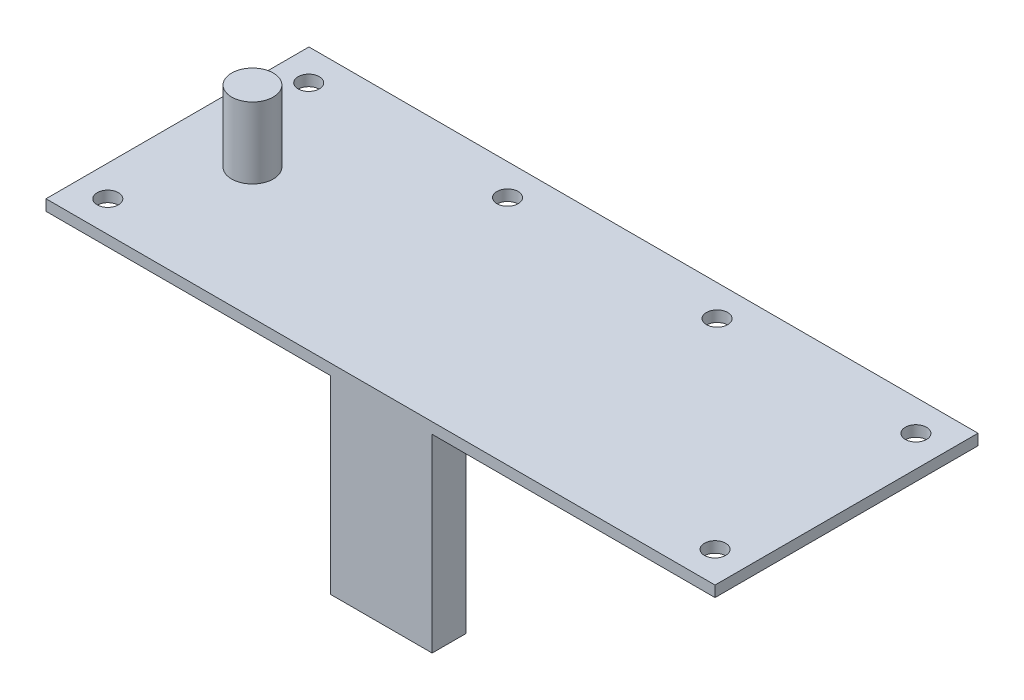
ISO-10303-21;
HEADER;
FILE_DESCRIPTION(('STEP AP214'),'2;1');
FILE_NAME('part.step','',(''),(''),'','','');
FILE_SCHEMA(('AUTOMOTIVE_DESIGN { 1 0 10303 214 1 1 1 1 }'));
ENDSEC;
DATA;
#1=APPLICATION_CONTEXT('core data for automotive mechanical design processes');
#2=APPLICATION_PROTOCOL_DEFINITION('international standard','automotive_design',2000,#1);
#3=PRODUCT_CONTEXT('',#1,'mechanical');
#4=PRODUCT('Part','Part','',(#3));
#5=PRODUCT_RELATED_PRODUCT_CATEGORY('part','',(#4));
#6=PRODUCT_DEFINITION_FORMATION('','',#4);
#7=PRODUCT_DEFINITION_CONTEXT('part definition',#1,'design');
#8=PRODUCT_DEFINITION('design','',#6,#7);
#9=PRODUCT_DEFINITION_SHAPE('','',#8);
#10=(LENGTH_UNIT() NAMED_UNIT(*) SI_UNIT(.MILLI.,.METRE.));
#11=(NAMED_UNIT(*) PLANE_ANGLE_UNIT() SI_UNIT($,.RADIAN.));
#12=(NAMED_UNIT(*) SI_UNIT($,.STERADIAN.) SOLID_ANGLE_UNIT());
#13=UNCERTAINTY_MEASURE_WITH_UNIT(LENGTH_MEASURE(1.E-05),#10,'distance_accuracy_value','');
#14=(GEOMETRIC_REPRESENTATION_CONTEXT(3) GLOBAL_UNCERTAINTY_ASSIGNED_CONTEXT((#13)) GLOBAL_UNIT_ASSIGNED_CONTEXT((#10,
#11,#12)) REPRESENTATION_CONTEXT('',''));
#15=CARTESIAN_POINT('',(0.,0.,0.));
#16=DIRECTION('',(0.,0.,1.));
#17=DIRECTION('',(1.,0.,0.));
#18=AXIS2_PLACEMENT_3D('',#15,#16,#17);
#19=CARTESIAN_POINT('',(0.,1.6383,0.));
#20=DIRECTION('',(0.,-1.,0.));
#21=DIRECTION('',(0.,0.,-1.));
#22=AXIS2_PLACEMENT_3D('',#19,#20,#21);
#23=PLANE('',#22);
#24=CARTESIAN_POINT('',(11.3792,1.6383,-19.6215));
#25=DIRECTION('',(0.,-1.,0.));
#26=DIRECTION('',(0.,0.,-1.));
#27=AXIS2_PLACEMENT_3D('',#24,#25,#26);
#28=CIRCLE('',#27,3.1242);
#29=CARTESIAN_POINT('',(11.3792,1.6383,-22.7457));
#30=VERTEX_POINT('',#29);
#31=EDGE_CURVE('E11',#30,#30,#28,.F.);
#32=ORIENTED_EDGE('',*,*,#31,.F.);
#33=EDGE_LOOP('',(#32));
#34=FACE_BOUND('',#33,.T.);
#35=DIRECTION('',(0.,0.,1.));
#36=VECTOR('',#35,1.);
#37=CARTESIAN_POINT('',(0.,1.6383,0.));
#38=LINE('',#37,#36);
#39=CARTESIAN_POINT('',(0.,1.6383,-39.4843));
#40=VERTEX_POINT('',#39);
#41=CARTESIAN_POINT('',(0.,1.6383,0.));
#42=VERTEX_POINT('',#41);
#43=EDGE_CURVE('E188',#40,#42,#38,.T.);
#44=ORIENTED_EDGE('',*,*,#43,.T.);
#45=DIRECTION('',(1.,0.,0.));
#46=VECTOR('',#45,1.);
#47=CARTESIAN_POINT('',(0.,1.6383,0.));
#48=LINE('',#47,#46);
#49=CARTESIAN_POINT('',(100.457,1.6383,0.));
#50=VERTEX_POINT('',#49);
#51=EDGE_CURVE('E192',#42,#50,#48,.T.);
#52=ORIENTED_EDGE('',*,*,#51,.T.);
#53=DIRECTION('',(0.,0.,-1.));
#54=VECTOR('',#53,1.);
#55=CARTESIAN_POINT('',(100.457,1.6383,0.));
#56=LINE('',#55,#54);
#57=CARTESIAN_POINT('',(100.457,1.6383,-39.4843));
#58=VERTEX_POINT('',#57);
#59=EDGE_CURVE('E196',#50,#58,#56,.T.);
#60=ORIENTED_EDGE('',*,*,#59,.T.);
#61=DIRECTION('',(-1.,0.,0.));
#62=VECTOR('',#61,1.);
#63=CARTESIAN_POINT('',(0.,1.6383,-39.4843));
#64=LINE('',#63,#62);
#65=EDGE_CURVE('E199',#58,#40,#64,.T.);
#66=ORIENTED_EDGE('',*,*,#65,.T.);
#67=EDGE_LOOP('',(#44,#52,#60,#66));
#68=FACE_BOUND('',#67,.T.);
#69=CARTESIAN_POINT('',(4.64185,1.6383,-34.80435));
#70=DIRECTION('',(0.,1.,0.));
#71=DIRECTION('',(0.,0.,1.));
#72=AXIS2_PLACEMENT_3D('',#69,#70,#71);
#73=CIRCLE('',#72,1.59385);
#74=CARTESIAN_POINT('',(4.64185,1.6383,-36.3982));
#75=VERTEX_POINT('',#74);
#76=EDGE_CURVE('E180',#75,#75,#73,.T.);
#77=ORIENTED_EDGE('',*,*,#76,.F.);
#78=EDGE_LOOP('',(#77));
#79=FACE_BOUND('',#78,.T.);
#80=CARTESIAN_POINT('',(65.95745,1.6383,-34.80435));
#81=DIRECTION('',(0.,1.,0.));
#82=DIRECTION('',(0.,0.,-1.));
#83=AXIS2_PLACEMENT_3D('',#80,#81,#82);
#84=CIRCLE('',#83,1.59385);
#85=CARTESIAN_POINT('',(65.95745,1.6383,-36.3982));
#86=VERTEX_POINT('',#85);
#87=EDGE_CURVE('E172',#86,#86,#84,.T.);
#88=ORIENTED_EDGE('',*,*,#87,.F.);
#89=EDGE_LOOP('',(#88));
#90=FACE_BOUND('',#89,.T.);
#91=CARTESIAN_POINT('',(34.49955,1.6383,-34.80435));
#92=DIRECTION('',(0.,1.,0.));
#93=DIRECTION('',(0.,0.,1.));
#94=AXIS2_PLACEMENT_3D('',#91,#92,#93);
#95=CIRCLE('',#94,1.59385);
#96=CARTESIAN_POINT('',(34.49955,1.6383,-36.3982));
#97=VERTEX_POINT('',#96);
#98=EDGE_CURVE('E164',#97,#97,#95,.T.);
#99=ORIENTED_EDGE('',*,*,#98,.F.);
#100=EDGE_LOOP('',(#99));
#101=FACE_BOUND('',#100,.T.);
#102=CARTESIAN_POINT('',(95.81515,1.6383,-34.80435));
#103=DIRECTION('',(0.,1.,0.));
#104=DIRECTION('',(0.,0.,-1.));
#105=AXIS2_PLACEMENT_3D('',#102,#103,#104);
#106=CIRCLE('',#105,1.59385);
#107=CARTESIAN_POINT('',(95.81515,1.6383,-36.3982));
#108=VERTEX_POINT('',#107);
#109=EDGE_CURVE('E156',#108,#108,#106,.T.);
#110=ORIENTED_EDGE('',*,*,#109,.F.);
#111=EDGE_LOOP('',(#110));
#112=FACE_BOUND('',#111,.T.);
#113=CARTESIAN_POINT('',(4.64185,1.6383,-4.64185));
#114=DIRECTION('',(0.,1.,0.));
#115=DIRECTION('',(0.,0.,1.));
#116=AXIS2_PLACEMENT_3D('',#113,#114,#115);
#117=CIRCLE('',#116,1.59385);
#118=CARTESIAN_POINT('',(4.64185,1.6383,-6.2357));
#119=VERTEX_POINT('',#118);
#120=EDGE_CURVE('E148',#119,#119,#117,.T.);
#121=ORIENTED_EDGE('',*,*,#120,.F.);
#122=EDGE_LOOP('',(#121));
#123=FACE_BOUND('',#122,.T.);
#124=CARTESIAN_POINT('',(95.81515,1.6383,-4.64185000000001));
#125=DIRECTION('',(0.,1.,0.));
#126=DIRECTION('',(0.,0.,-1.));
#127=AXIS2_PLACEMENT_3D('',#124,#125,#126);
#128=CIRCLE('',#127,1.59385);
#129=CARTESIAN_POINT('',(95.81515,1.6383,-6.23570000000001));
#130=VERTEX_POINT('',#129);
#131=EDGE_CURVE('E140',#130,#130,#128,.T.);
#132=ORIENTED_EDGE('',*,*,#131,.F.);
#133=EDGE_LOOP('',(#132));
#134=FACE_BOUND('',#133,.T.);
#135=ADVANCED_FACE('F39',(#34,#68,#79,#90,#101,#112,#123,#134),#23,.F.);
#136=CARTESIAN_POINT('',(0.,0.,0.));
#137=DIRECTION('',(0.,-1.,0.));
#138=DIRECTION('',(0.,0.,-1.));
#139=AXIS2_PLACEMENT_3D('',#136,#137,#138);
#140=PLANE('',#139);
#141=DIRECTION('',(0.,0.,1.));
#142=VECTOR('',#141,1.);
#143=CARTESIAN_POINT('',(57.98185,0.,0.));
#144=LINE('',#143,#142);
#145=CARTESIAN_POINT('',(57.98185,0.,-5.08));
#146=VERTEX_POINT('',#145);
#147=CARTESIAN_POINT('',(57.98185,0.,0.));
#148=VERTEX_POINT('',#147);
#149=EDGE_CURVE('E55',#146,#148,#144,.T.);
#150=ORIENTED_EDGE('',*,*,#149,.F.);
#151=DIRECTION('',(1.,0.,0.));
#152=VECTOR('',#151,1.);
#153=CARTESIAN_POINT('',(57.98185,0.,-5.08));
#154=LINE('',#153,#152);
#155=CARTESIAN_POINT('',(42.74185,0.,-5.08));
#156=VERTEX_POINT('',#155);
#157=EDGE_CURVE('E125',#156,#146,#154,.T.);
#158=ORIENTED_EDGE('',*,*,#157,.F.);
#159=DIRECTION('',(0.,0.,-1.));
#160=VECTOR('',#159,1.);
#161=CARTESIAN_POINT('',(42.74185,0.,0.));
#162=LINE('',#161,#160);
#163=CARTESIAN_POINT('',(42.74185,0.,0.));
#164=VERTEX_POINT('',#163);
#165=EDGE_CURVE('E236',#164,#156,#162,.T.);
#166=ORIENTED_EDGE('',*,*,#165,.F.);
#167=DIRECTION('',(1.,0.,0.));
#168=VECTOR('',#167,1.);
#169=CARTESIAN_POINT('',(0.,0.,0.));
#170=LINE('',#169,#168);
#171=CARTESIAN_POINT('',(0.,0.,0.));
#172=VERTEX_POINT('',#171);
#173=EDGE_CURVE('E206',#172,#164,#170,.T.);
#174=ORIENTED_EDGE('',*,*,#173,.F.);
#175=DIRECTION('',(0.,0.,1.));
#176=VECTOR('',#175,1.);
#177=CARTESIAN_POINT('',(0.,0.,0.));
#178=LINE('',#177,#176);
#179=CARTESIAN_POINT('',(0.,0.,-39.4843));
#180=VERTEX_POINT('',#179);
#181=EDGE_CURVE('E184',#180,#172,#178,.T.);
#182=ORIENTED_EDGE('',*,*,#181,.F.);
#183=DIRECTION('',(-1.,0.,0.));
#184=VECTOR('',#183,1.);
#185=CARTESIAN_POINT('',(0.,0.,-39.4843));
#186=LINE('',#185,#184);
#187=CARTESIAN_POINT('',(100.457,0.,-39.4843));
#188=VERTEX_POINT('',#187);
#189=EDGE_CURVE('E193',#188,#180,#186,.T.);
#190=ORIENTED_EDGE('',*,*,#189,.F.);
#191=DIRECTION('',(0.,0.,-1.));
#192=VECTOR('',#191,1.);
#193=CARTESIAN_POINT('',(100.457,0.,0.));
#194=LINE('',#193,#192);
#195=CARTESIAN_POINT('',(100.457,0.,0.));
#196=VERTEX_POINT('',#195);
#197=EDGE_CURVE('E209',#196,#188,#194,.T.);
#198=ORIENTED_EDGE('',*,*,#197,.F.);
#199=EDGE_CURVE('E60',#148,#196,#170,.T.);
#200=ORIENTED_EDGE('',*,*,#199,.F.);
#201=EDGE_LOOP('',(#150,#158,#166,#174,#182,#190,#198,#200));
#202=FACE_BOUND('',#201,.T.);
#203=CARTESIAN_POINT('',(4.64185,0.,-4.64185));
#204=DIRECTION('',(0.,1.,0.));
#205=DIRECTION('',(0.,0.,1.));
#206=AXIS2_PLACEMENT_3D('',#203,#204,#205);
#207=CIRCLE('',#206,1.59385);
#208=CARTESIAN_POINT('',(4.64185,0.,-6.2357));
#209=VERTEX_POINT('',#208);
#210=EDGE_CURVE('E144',#209,#209,#207,.T.);
#211=ORIENTED_EDGE('',*,*,#210,.T.);
#212=EDGE_LOOP('',(#211));
#213=FACE_BOUND('',#212,.T.);
#214=CARTESIAN_POINT('',(34.49955,0.,-34.80435));
#215=DIRECTION('',(0.,1.,0.));
#216=DIRECTION('',(0.,0.,1.));
#217=AXIS2_PLACEMENT_3D('',#214,#215,#216);
#218=CIRCLE('',#217,1.59385);
#219=CARTESIAN_POINT('',(34.49955,0.,-36.3982));
#220=VERTEX_POINT('',#219);
#221=EDGE_CURVE('E160',#220,#220,#218,.T.);
#222=ORIENTED_EDGE('',*,*,#221,.T.);
#223=EDGE_LOOP('',(#222));
#224=FACE_BOUND('',#223,.T.);
#225=CARTESIAN_POINT('',(4.64185,0.,-34.80435));
#226=DIRECTION('',(0.,1.,0.));
#227=DIRECTION('',(0.,0.,1.));
#228=AXIS2_PLACEMENT_3D('',#225,#226,#227);
#229=CIRCLE('',#228,1.59385);
#230=CARTESIAN_POINT('',(4.64185,0.,-36.3982));
#231=VERTEX_POINT('',#230);
#232=EDGE_CURVE('E176',#231,#231,#229,.T.);
#233=ORIENTED_EDGE('',*,*,#232,.T.);
#234=EDGE_LOOP('',(#233));
#235=FACE_BOUND('',#234,.T.);
#236=CARTESIAN_POINT('',(65.95745,0.,-34.80435));
#237=DIRECTION('',(0.,1.,0.));
#238=DIRECTION('',(0.,0.,-1.));
#239=AXIS2_PLACEMENT_3D('',#236,#237,#238);
#240=CIRCLE('',#239,1.59385);
#241=CARTESIAN_POINT('',(65.95745,0.,-36.3982));
#242=VERTEX_POINT('',#241);
#243=EDGE_CURVE('E168',#242,#242,#240,.T.);
#244=ORIENTED_EDGE('',*,*,#243,.T.);
#245=EDGE_LOOP('',(#244));
#246=FACE_BOUND('',#245,.T.);
#247=CARTESIAN_POINT('',(95.81515,0.,-34.80435));
#248=DIRECTION('',(0.,1.,0.));
#249=DIRECTION('',(0.,0.,-1.));
#250=AXIS2_PLACEMENT_3D('',#247,#248,#249);
#251=CIRCLE('',#250,1.59385);
#252=CARTESIAN_POINT('',(95.81515,0.,-36.3982));
#253=VERTEX_POINT('',#252);
#254=EDGE_CURVE('E152',#253,#253,#251,.T.);
#255=ORIENTED_EDGE('',*,*,#254,.T.);
#256=EDGE_LOOP('',(#255));
#257=FACE_BOUND('',#256,.T.);
#258=CARTESIAN_POINT('',(95.81515,0.,-4.64185000000001));
#259=DIRECTION('',(0.,1.,0.));
#260=DIRECTION('',(0.,0.,-1.));
#261=AXIS2_PLACEMENT_3D('',#258,#259,#260);
#262=CIRCLE('',#261,1.59385);
#263=CARTESIAN_POINT('',(95.81515,0.,-6.23570000000001));
#264=VERTEX_POINT('',#263);
#265=EDGE_CURVE('E134',#264,#264,#262,.T.);
#266=ORIENTED_EDGE('',*,*,#265,.T.);
#267=EDGE_LOOP('',(#266));
#268=FACE_BOUND('',#267,.T.);
#269=ADVANCED_FACE('F233',(#202,#213,#224,#235,#246,#257,#268),#140,.T.);
#270=CARTESIAN_POINT('',(0.,1.6383,0.));
#271=DIRECTION('',(1.,0.,0.));
#272=DIRECTION('',(0.,0.,-1.));
#273=AXIS2_PLACEMENT_3D('',#270,#271,#272);
#274=PLANE('',#273);
#275=ORIENTED_EDGE('',*,*,#181,.T.);
#276=DIRECTION('',(0.,-1.,0.));
#277=VECTOR('',#276,1.);
#278=CARTESIAN_POINT('',(0.,1.6383,0.));
#279=LINE('',#278,#277);
#280=EDGE_CURVE('E48',#42,#172,#279,.T.);
#281=ORIENTED_EDGE('',*,*,#280,.F.);
#282=ORIENTED_EDGE('',*,*,#43,.F.);
#283=DIRECTION('',(0.,-1.,0.));
#284=VECTOR('',#283,1.);
#285=CARTESIAN_POINT('',(0.,1.6383,-39.4843));
#286=LINE('',#285,#284);
#287=EDGE_CURVE('E202',#40,#180,#286,.T.);
#288=ORIENTED_EDGE('',*,*,#287,.T.);
#289=EDGE_LOOP('',(#275,#281,#282,#288));
#290=FACE_BOUND('',#289,.T.);
#291=ADVANCED_FACE('F41',(#290),#274,.F.);
#292=CARTESIAN_POINT('',(0.,1.6383,0.));
#293=DIRECTION('',(0.,0.,-1.));
#294=DIRECTION('',(-1.,0.,0.));
#295=AXIS2_PLACEMENT_3D('',#292,#293,#294);
#296=PLANE('',#295);
#297=ORIENTED_EDGE('',*,*,#173,.T.);
#298=DIRECTION('',(0.,1.,0.));
#299=VECTOR('',#298,1.);
#300=CARTESIAN_POINT('',(42.74185,-28.448,0.));
#301=LINE('',#300,#299);
#302=CARTESIAN_POINT('',(42.74185,-28.448,0.));
#303=VERTEX_POINT('',#302);
#304=EDGE_CURVE('E110',#303,#164,#301,.T.);
#305=ORIENTED_EDGE('',*,*,#304,.F.);
#306=DIRECTION('',(-1.,0.,0.));
#307=VECTOR('',#306,1.);
#308=CARTESIAN_POINT('',(57.98185,-28.448,0.));
#309=LINE('',#308,#307);
#310=CARTESIAN_POINT('',(57.98185,-28.448,0.));
#311=VERTEX_POINT('',#310);
#312=EDGE_CURVE('E103',#311,#303,#309,.T.);
#313=ORIENTED_EDGE('',*,*,#312,.F.);
#314=DIRECTION('',(0.,1.,0.));
#315=VECTOR('',#314,1.);
#316=CARTESIAN_POINT('',(57.98185,-28.448,0.));
#317=LINE('',#316,#315);
#318=EDGE_CURVE('E108',#311,#148,#317,.T.);
#319=ORIENTED_EDGE('',*,*,#318,.T.);
#320=ORIENTED_EDGE('',*,*,#199,.T.);
#321=DIRECTION('',(0.,-1.,0.));
#322=VECTOR('',#321,1.);
#323=CARTESIAN_POINT('',(100.457,1.6383,0.));
#324=LINE('',#323,#322);
#325=EDGE_CURVE('E221',#50,#196,#324,.T.);
#326=ORIENTED_EDGE('',*,*,#325,.F.);
#327=ORIENTED_EDGE('',*,*,#51,.F.);
#328=ORIENTED_EDGE('',*,*,#280,.T.);
#329=EDGE_LOOP('',(#297,#305,#313,#319,#320,#326,#327,#328));
#330=FACE_BOUND('',#329,.T.);
#331=ADVANCED_FACE('F106',(#330),#296,.F.);
#332=CARTESIAN_POINT('',(100.457,1.6383,0.));
#333=DIRECTION('',(-1.,0.,0.));
#334=DIRECTION('',(0.,0.,1.));
#335=AXIS2_PLACEMENT_3D('',#332,#333,#334);
#336=PLANE('',#335);
#337=ORIENTED_EDGE('',*,*,#197,.T.);
#338=DIRECTION('',(0.,-1.,0.));
#339=VECTOR('',#338,1.);
#340=CARTESIAN_POINT('',(100.457,1.6383,-39.4843));
#341=LINE('',#340,#339);
#342=EDGE_CURVE('E217',#58,#188,#341,.T.);
#343=ORIENTED_EDGE('',*,*,#342,.F.);
#344=ORIENTED_EDGE('',*,*,#59,.F.);
#345=ORIENTED_EDGE('',*,*,#325,.T.);
#346=EDGE_LOOP('',(#337,#343,#344,#345));
#347=FACE_BOUND('',#346,.T.);
#348=ADVANCED_FACE('F282',(#347),#336,.F.);
#349=CARTESIAN_POINT('',(0.,1.6383,-39.4843));
#350=DIRECTION('',(0.,0.,1.));
#351=DIRECTION('',(1.,0.,0.));
#352=AXIS2_PLACEMENT_3D('',#349,#350,#351);
#353=PLANE('',#352);
#354=ORIENTED_EDGE('',*,*,#189,.T.);
#355=ORIENTED_EDGE('',*,*,#287,.F.);
#356=ORIENTED_EDGE('',*,*,#65,.F.);
#357=ORIENTED_EDGE('',*,*,#342,.T.);
#358=EDGE_LOOP('',(#354,#355,#356,#357));
#359=FACE_BOUND('',#358,.T.);
#360=ADVANCED_FACE('F279',(#359),#353,.F.);
#361=CARTESIAN_POINT('',(4.64185,1.6383,-34.80435));
#362=DIRECTION('',(0.,-1.,0.));
#363=DIRECTION('',(0.,0.,-1.));
#364=AXIS2_PLACEMENT_3D('',#361,#362,#363);
#365=CYLINDRICAL_SURFACE('',#364,1.59385);
#366=CARTESIAN_POINT('',(4.64185,1.6383,-36.3982));
#367=CARTESIAN_POINT('',(4.64185,1.621234375,-36.3982));
#368=CARTESIAN_POINT('',(4.64185,1.60416875,-36.3982));
#369=CARTESIAN_POINT('',(4.64185,1.5700375,-36.3982));
#370=CARTESIAN_POINT('',(4.64185,1.552971875,-36.3982));
#371=CARTESIAN_POINT('',(4.64185,1.518840625,-36.3982));
#372=CARTESIAN_POINT('',(4.64185,1.501775,-36.3982));
#373=CARTESIAN_POINT('',(4.64185,1.46764375,-36.3982));
#374=CARTESIAN_POINT('',(4.64185,1.450578125,-36.3982));
#375=CARTESIAN_POINT('',(4.64185,1.416446875,-36.3982));
#376=CARTESIAN_POINT('',(4.64185,1.39938125,-36.3982));
#377=CARTESIAN_POINT('',(4.64185,1.36525,-36.3982));
#378=CARTESIAN_POINT('',(4.64185,1.348184375,-36.3982));
#379=CARTESIAN_POINT('',(4.64185,1.314053125,-36.3982));
#380=CARTESIAN_POINT('',(4.64185,1.2969875,-36.3982));
#381=CARTESIAN_POINT('',(4.64185,1.26285625,-36.3982));
#382=CARTESIAN_POINT('',(4.64185,1.245790625,-36.3982));
#383=CARTESIAN_POINT('',(4.64185,1.211659375,-36.3982));
#384=CARTESIAN_POINT('',(4.64185,1.19459375,-36.3982));
#385=CARTESIAN_POINT('',(4.64185,1.1604625,-36.3982));
#386=CARTESIAN_POINT('',(4.64185,1.143396875,-36.3982));
#387=CARTESIAN_POINT('',(4.64185,1.109265625,-36.3982));
#388=CARTESIAN_POINT('',(4.64185,1.0922,-36.3982));
#389=CARTESIAN_POINT('',(4.64185,1.05806875,-36.3982));
#390=CARTESIAN_POINT('',(4.64185,1.041003125,-36.3982));
#391=CARTESIAN_POINT('',(4.64185,1.006871875,-36.3982));
#392=CARTESIAN_POINT('',(4.64185,0.98980625,-36.3982));
#393=CARTESIAN_POINT('',(4.64185,0.955675,-36.3982));
#394=CARTESIAN_POINT('',(4.64185,0.938609375,-36.3982));
#395=CARTESIAN_POINT('',(4.64185,0.904478125,-36.3982));
#396=CARTESIAN_POINT('',(4.64185,0.8874125,-36.3982));
#397=CARTESIAN_POINT('',(4.64185,0.85328125,-36.3982));
#398=CARTESIAN_POINT('',(4.64185,0.836215625,-36.3982));
#399=CARTESIAN_POINT('',(4.64185,0.802084375,-36.3982));
#400=CARTESIAN_POINT('',(4.64185,0.78501875,-36.3982));
#401=CARTESIAN_POINT('',(4.64185,0.7508875,-36.3982));
#402=CARTESIAN_POINT('',(4.64185,0.733821875,-36.3982));
#403=CARTESIAN_POINT('',(4.64185,0.699690625,-36.3982));
#404=CARTESIAN_POINT('',(4.64185,0.682625,-36.3982));
#405=CARTESIAN_POINT('',(4.64185,0.64849375,-36.3982));
#406=CARTESIAN_POINT('',(4.64185,0.631428125,-36.3982));
#407=CARTESIAN_POINT('',(4.64185,0.597296875,-36.3982));
#408=CARTESIAN_POINT('',(4.64185,0.58023125,-36.3982));
#409=CARTESIAN_POINT('',(4.64185,0.5461,-36.3982));
#410=CARTESIAN_POINT('',(4.64185,0.529034375,-36.3982));
#411=CARTESIAN_POINT('',(4.64185,0.494903125,-36.3982));
#412=CARTESIAN_POINT('',(4.64185,0.4778375,-36.3982));
#413=CARTESIAN_POINT('',(4.64185,0.44370625,-36.3982));
#414=CARTESIAN_POINT('',(4.64185,0.426640625,-36.3982));
#415=CARTESIAN_POINT('',(4.64185,0.392509375,-36.3982));
#416=CARTESIAN_POINT('',(4.64185,0.37544375,-36.3982));
#417=CARTESIAN_POINT('',(4.64185,0.3413125,-36.3982));
#418=CARTESIAN_POINT('',(4.64185,0.324246875,-36.3982));
#419=CARTESIAN_POINT('',(4.64185,0.290115625,-36.3982));
#420=CARTESIAN_POINT('',(4.64185,0.27305,-36.3982));
#421=CARTESIAN_POINT('',(4.64185,0.23891875,-36.3982));
#422=CARTESIAN_POINT('',(4.64185,0.221853125,-36.3982));
#423=CARTESIAN_POINT('',(4.64185,0.187721875,-36.3982));
#424=CARTESIAN_POINT('',(4.64185,0.17065625,-36.3982));
#425=CARTESIAN_POINT('',(4.64185,0.136525,-36.3982));
#426=CARTESIAN_POINT('',(4.64185,0.119459375,-36.3982));
#427=CARTESIAN_POINT('',(4.64185,0.0853281249999998,-36.3982));
#428=CARTESIAN_POINT('',(4.64185,0.0682624999999998,-36.3982));
#429=CARTESIAN_POINT('',(4.64185,0.0341312499999998,-36.3982));
#430=CARTESIAN_POINT('',(4.64185,0.0170656249999998,-36.3982));
#431=CARTESIAN_POINT('',(4.64185,0.,-36.3982));
#432=B_SPLINE_CURVE_WITH_KNOTS('',3,(#366,#367,#368,#369,#370,#371,#372,#373,#374,#375,#376,
#377,#378,#379,#380,#381,#382,#383,#384,#385,#386,#387,#388,#389,#390,#391,#392,#393,#394,#395,
#396,#397,#398,#399,#400,#401,#402,#403,#404,#405,#406,#407,#408,#409,#410,#411,#412,#413,#414,
#415,#416,#417,#418,#419,#420,#421,#422,#423,#424,#425,#426,#427,#428,#429,#430,#431),
.UNSPECIFIED.,.F.,.F.,(4,2,2,2,2,2,2,2,2,2,2,2,2,2,2,2,2,2,2,2,2,2,2,2,2,2,2,2,2,2,2,2,4),(0.,
0.0511968749999999,0.10239375,0.153590625,0.2047875,0.255984375,0.30718125,0.358378125,0.409575,
0.460771875,0.51196875,0.563165625,0.6143625,0.665559375,0.71675625,0.767953125,0.81915,
0.870346875,0.92154375,0.972740625,1.0239375,1.075134375,1.12633125,1.177528125,1.228725,
1.279921875,1.33111875,1.382315625,1.4335125,1.484709375,1.53590625,1.587103125,1.6383),.UNSPECIFIED.);
#433=EDGE_CURVE('BSEAM276',#75,#231,#432,.T.);
#434=ORIENTED_EDGE('',*,*,#76,.T.);
#435=ORIENTED_EDGE('',*,*,#232,.F.);
#436=ORIENTED_EDGE('',*,*,#433,.T.);
#437=ORIENTED_EDGE('',*,*,#433,.F.);
#438=EDGE_LOOP('',(#434,#436,#435,#437));
#439=FACE_BOUND('',#438,.T.);
#440=ADVANCED_FACE('F276',(#439),#365,.F.);
#441=CARTESIAN_POINT('',(65.95745,1.6383,-34.80435));
#442=DIRECTION('',(0.,-1.,0.));
#443=DIRECTION('',(0.,0.,-1.));
#444=AXIS2_PLACEMENT_3D('',#441,#442,#443);
#445=CYLINDRICAL_SURFACE('',#444,1.59385);
#446=CARTESIAN_POINT('',(65.95745,1.6383,-36.3982));
#447=CARTESIAN_POINT('',(65.95745,1.621234375,-36.3982));
#448=CARTESIAN_POINT('',(65.95745,1.60416875,-36.3982));
#449=CARTESIAN_POINT('',(65.95745,1.5700375,-36.3982));
#450=CARTESIAN_POINT('',(65.95745,1.552971875,-36.3982));
#451=CARTESIAN_POINT('',(65.95745,1.518840625,-36.3982));
#452=CARTESIAN_POINT('',(65.95745,1.501775,-36.3982));
#453=CARTESIAN_POINT('',(65.95745,1.46764375,-36.3982));
#454=CARTESIAN_POINT('',(65.95745,1.450578125,-36.3982));
#455=CARTESIAN_POINT('',(65.95745,1.416446875,-36.3982));
#456=CARTESIAN_POINT('',(65.95745,1.39938125,-36.3982));
#457=CARTESIAN_POINT('',(65.95745,1.36525,-36.3982));
#458=CARTESIAN_POINT('',(65.95745,1.348184375,-36.3982));
#459=CARTESIAN_POINT('',(65.95745,1.314053125,-36.3982));
#460=CARTESIAN_POINT('',(65.95745,1.2969875,-36.3982));
#461=CARTESIAN_POINT('',(65.95745,1.26285625,-36.3982));
#462=CARTESIAN_POINT('',(65.95745,1.245790625,-36.3982));
#463=CARTESIAN_POINT('',(65.95745,1.211659375,-36.3982));
#464=CARTESIAN_POINT('',(65.95745,1.19459375,-36.3982));
#465=CARTESIAN_POINT('',(65.95745,1.1604625,-36.3982));
#466=CARTESIAN_POINT('',(65.95745,1.143396875,-36.3982));
#467=CARTESIAN_POINT('',(65.95745,1.109265625,-36.3982));
#468=CARTESIAN_POINT('',(65.95745,1.0922,-36.3982));
#469=CARTESIAN_POINT('',(65.95745,1.05806875,-36.3982));
#470=CARTESIAN_POINT('',(65.95745,1.041003125,-36.3982));
#471=CARTESIAN_POINT('',(65.95745,1.006871875,-36.3982));
#472=CARTESIAN_POINT('',(65.95745,0.98980625,-36.3982));
#473=CARTESIAN_POINT('',(65.95745,0.955675,-36.3982));
#474=CARTESIAN_POINT('',(65.95745,0.938609375,-36.3982));
#475=CARTESIAN_POINT('',(65.95745,0.904478125,-36.3982));
#476=CARTESIAN_POINT('',(65.95745,0.8874125,-36.3982));
#477=CARTESIAN_POINT('',(65.95745,0.85328125,-36.3982));
#478=CARTESIAN_POINT('',(65.95745,0.836215625,-36.3982));
#479=CARTESIAN_POINT('',(65.95745,0.802084375,-36.3982));
#480=CARTESIAN_POINT('',(65.95745,0.78501875,-36.3982));
#481=CARTESIAN_POINT('',(65.95745,0.7508875,-36.3982));
#482=CARTESIAN_POINT('',(65.95745,0.733821875,-36.3982));
#483=CARTESIAN_POINT('',(65.95745,0.699690625,-36.3982));
#484=CARTESIAN_POINT('',(65.95745,0.682625,-36.3982));
#485=CARTESIAN_POINT('',(65.95745,0.64849375,-36.3982));
#486=CARTESIAN_POINT('',(65.95745,0.631428125,-36.3982));
#487=CARTESIAN_POINT('',(65.95745,0.597296875,-36.3982));
#488=CARTESIAN_POINT('',(65.95745,0.58023125,-36.3982));
#489=CARTESIAN_POINT('',(65.95745,0.5461,-36.3982));
#490=CARTESIAN_POINT('',(65.95745,0.529034375,-36.3982));
#491=CARTESIAN_POINT('',(65.95745,0.494903125,-36.3982));
#492=CARTESIAN_POINT('',(65.95745,0.4778375,-36.3982));
#493=CARTESIAN_POINT('',(65.95745,0.44370625,-36.3982));
#494=CARTESIAN_POINT('',(65.95745,0.426640625,-36.3982));
#495=CARTESIAN_POINT('',(65.95745,0.392509375,-36.3982));
#496=CARTESIAN_POINT('',(65.95745,0.37544375,-36.3982));
#497=CARTESIAN_POINT('',(65.95745,0.3413125,-36.3982));
#498=CARTESIAN_POINT('',(65.95745,0.324246875,-36.3982));
#499=CARTESIAN_POINT('',(65.95745,0.290115625,-36.3982));
#500=CARTESIAN_POINT('',(65.95745,0.27305,-36.3982));
#501=CARTESIAN_POINT('',(65.95745,0.23891875,-36.3982));
#502=CARTESIAN_POINT('',(65.95745,0.221853125,-36.3982));
#503=CARTESIAN_POINT('',(65.95745,0.187721875,-36.3982));
#504=CARTESIAN_POINT('',(65.95745,0.17065625,-36.3982));
#505=CARTESIAN_POINT('',(65.95745,0.136525,-36.3982));
#506=CARTESIAN_POINT('',(65.95745,0.119459375,-36.3982));
#507=CARTESIAN_POINT('',(65.95745,0.0853281249999998,-36.3982));
#508=CARTESIAN_POINT('',(65.95745,0.0682624999999998,-36.3982));
#509=CARTESIAN_POINT('',(65.95745,0.0341312499999998,-36.3982));
#510=CARTESIAN_POINT('',(65.95745,0.0170656249999998,-36.3982));
#511=CARTESIAN_POINT('',(65.95745,0.,-36.3982));
#512=B_SPLINE_CURVE_WITH_KNOTS('',3,(#446,#447,#448,#449,#450,#451,#452,#453,#454,#455,#456,
#457,#458,#459,#460,#461,#462,#463,#464,#465,#466,#467,#468,#469,#470,#471,#472,#473,#474,#475,
#476,#477,#478,#479,#480,#481,#482,#483,#484,#485,#486,#487,#488,#489,#490,#491,#492,#493,#494,
#495,#496,#497,#498,#499,#500,#501,#502,#503,#504,#505,#506,#507,#508,#509,#510,#511),
.UNSPECIFIED.,.F.,.F.,(4,2,2,2,2,2,2,2,2,2,2,2,2,2,2,2,2,2,2,2,2,2,2,2,2,2,2,2,2,2,2,2,4),(0.,
0.0511968749999999,0.10239375,0.153590625,0.2047875,0.255984375,0.30718125,0.358378125,0.409575,
0.460771875,0.51196875,0.563165625,0.6143625,0.665559375,0.71675625,0.767953125,0.81915,
0.870346875,0.92154375,0.972740625,1.0239375,1.075134375,1.12633125,1.177528125,1.228725,
1.279921875,1.33111875,1.382315625,1.4335125,1.484709375,1.53590625,1.587103125,1.6383),.UNSPECIFIED.);
#513=EDGE_CURVE('BSEAM375',#86,#242,#512,.T.);
#514=ORIENTED_EDGE('',*,*,#87,.T.);
#515=ORIENTED_EDGE('',*,*,#243,.F.);
#516=ORIENTED_EDGE('',*,*,#513,.T.);
#517=ORIENTED_EDGE('',*,*,#513,.F.);
#518=EDGE_LOOP('',(#514,#516,#515,#517));
#519=FACE_BOUND('',#518,.T.);
#520=ADVANCED_FACE('F375',(#519),#445,.F.);
#521=CARTESIAN_POINT('',(34.49955,1.6383,-34.80435));
#522=DIRECTION('',(0.,-1.,0.));
#523=DIRECTION('',(0.,0.,-1.));
#524=AXIS2_PLACEMENT_3D('',#521,#522,#523);
#525=CYLINDRICAL_SURFACE('',#524,1.59385);
#526=CARTESIAN_POINT('',(34.49955,1.6383,-36.3982));
#527=CARTESIAN_POINT('',(34.49955,1.621234375,-36.3982));
#528=CARTESIAN_POINT('',(34.49955,1.60416875,-36.3982));
#529=CARTESIAN_POINT('',(34.49955,1.5700375,-36.3982));
#530=CARTESIAN_POINT('',(34.49955,1.552971875,-36.3982));
#531=CARTESIAN_POINT('',(34.49955,1.518840625,-36.3982));
#532=CARTESIAN_POINT('',(34.49955,1.501775,-36.3982));
#533=CARTESIAN_POINT('',(34.49955,1.46764375,-36.3982));
#534=CARTESIAN_POINT('',(34.49955,1.450578125,-36.3982));
#535=CARTESIAN_POINT('',(34.49955,1.416446875,-36.3982));
#536=CARTESIAN_POINT('',(34.49955,1.39938125,-36.3982));
#537=CARTESIAN_POINT('',(34.49955,1.36525,-36.3982));
#538=CARTESIAN_POINT('',(34.49955,1.348184375,-36.3982));
#539=CARTESIAN_POINT('',(34.49955,1.314053125,-36.3982));
#540=CARTESIAN_POINT('',(34.49955,1.2969875,-36.3982));
#541=CARTESIAN_POINT('',(34.49955,1.26285625,-36.3982));
#542=CARTESIAN_POINT('',(34.49955,1.245790625,-36.3982));
#543=CARTESIAN_POINT('',(34.49955,1.211659375,-36.3982));
#544=CARTESIAN_POINT('',(34.49955,1.19459375,-36.3982));
#545=CARTESIAN_POINT('',(34.49955,1.1604625,-36.3982));
#546=CARTESIAN_POINT('',(34.49955,1.143396875,-36.3982));
#547=CARTESIAN_POINT('',(34.49955,1.109265625,-36.3982));
#548=CARTESIAN_POINT('',(34.49955,1.0922,-36.3982));
#549=CARTESIAN_POINT('',(34.49955,1.05806875,-36.3982));
#550=CARTESIAN_POINT('',(34.49955,1.041003125,-36.3982));
#551=CARTESIAN_POINT('',(34.49955,1.006871875,-36.3982));
#552=CARTESIAN_POINT('',(34.49955,0.98980625,-36.3982));
#553=CARTESIAN_POINT('',(34.49955,0.955675,-36.3982));
#554=CARTESIAN_POINT('',(34.49955,0.938609375,-36.3982));
#555=CARTESIAN_POINT('',(34.49955,0.904478125,-36.3982));
#556=CARTESIAN_POINT('',(34.49955,0.8874125,-36.3982));
#557=CARTESIAN_POINT('',(34.49955,0.85328125,-36.3982));
#558=CARTESIAN_POINT('',(34.49955,0.836215625,-36.3982));
#559=CARTESIAN_POINT('',(34.49955,0.802084375,-36.3982));
#560=CARTESIAN_POINT('',(34.49955,0.78501875,-36.3982));
#561=CARTESIAN_POINT('',(34.49955,0.7508875,-36.3982));
#562=CARTESIAN_POINT('',(34.49955,0.733821875,-36.3982));
#563=CARTESIAN_POINT('',(34.49955,0.699690625,-36.3982));
#564=CARTESIAN_POINT('',(34.49955,0.682625,-36.3982));
#565=CARTESIAN_POINT('',(34.49955,0.64849375,-36.3982));
#566=CARTESIAN_POINT('',(34.49955,0.631428125,-36.3982));
#567=CARTESIAN_POINT('',(34.49955,0.597296875,-36.3982));
#568=CARTESIAN_POINT('',(34.49955,0.58023125,-36.3982));
#569=CARTESIAN_POINT('',(34.49955,0.5461,-36.3982));
#570=CARTESIAN_POINT('',(34.49955,0.529034375,-36.3982));
#571=CARTESIAN_POINT('',(34.49955,0.494903125,-36.3982));
#572=CARTESIAN_POINT('',(34.49955,0.4778375,-36.3982));
#573=CARTESIAN_POINT('',(34.49955,0.44370625,-36.3982));
#574=CARTESIAN_POINT('',(34.49955,0.426640625,-36.3982));
#575=CARTESIAN_POINT('',(34.49955,0.392509375,-36.3982));
#576=CARTESIAN_POINT('',(34.49955,0.37544375,-36.3982));
#577=CARTESIAN_POINT('',(34.49955,0.3413125,-36.3982));
#578=CARTESIAN_POINT('',(34.49955,0.324246875,-36.3982));
#579=CARTESIAN_POINT('',(34.49955,0.290115625,-36.3982));
#580=CARTESIAN_POINT('',(34.49955,0.27305,-36.3982));
#581=CARTESIAN_POINT('',(34.49955,0.23891875,-36.3982));
#582=CARTESIAN_POINT('',(34.49955,0.221853125,-36.3982));
#583=CARTESIAN_POINT('',(34.49955,0.187721875,-36.3982));
#584=CARTESIAN_POINT('',(34.49955,0.17065625,-36.3982));
#585=CARTESIAN_POINT('',(34.49955,0.136525,-36.3982));
#586=CARTESIAN_POINT('',(34.49955,0.119459375,-36.3982));
#587=CARTESIAN_POINT('',(34.49955,0.0853281249999998,-36.3982));
#588=CARTESIAN_POINT('',(34.49955,0.0682624999999998,-36.3982));
#589=CARTESIAN_POINT('',(34.49955,0.0341312499999998,-36.3982));
#590=CARTESIAN_POINT('',(34.49955,0.0170656249999998,-36.3982));
#591=CARTESIAN_POINT('',(34.49955,0.,-36.3982));
#592=B_SPLINE_CURVE_WITH_KNOTS('',3,(#526,#527,#528,#529,#530,#531,#532,#533,#534,#535,#536,
#537,#538,#539,#540,#541,#542,#543,#544,#545,#546,#547,#548,#549,#550,#551,#552,#553,#554,#555,
#556,#557,#558,#559,#560,#561,#562,#563,#564,#565,#566,#567,#568,#569,#570,#571,#572,#573,#574,
#575,#576,#577,#578,#579,#580,#581,#582,#583,#584,#585,#586,#587,#588,#589,#590,#591),
.UNSPECIFIED.,.F.,.F.,(4,2,2,2,2,2,2,2,2,2,2,2,2,2,2,2,2,2,2,2,2,2,2,2,2,2,2,2,2,2,2,2,4),(0.,
0.0511968749999999,0.10239375,0.153590625,0.2047875,0.255984375,0.30718125,0.358378125,0.409575,
0.460771875,0.51196875,0.563165625,0.6143625,0.665559375,0.71675625,0.767953125,0.81915,
0.870346875,0.92154375,0.972740625,1.0239375,1.075134375,1.12633125,1.177528125,1.228725,
1.279921875,1.33111875,1.382315625,1.4335125,1.484709375,1.53590625,1.587103125,1.6383),.UNSPECIFIED.);
#593=EDGE_CURVE('BSEAM367',#97,#220,#592,.T.);
#594=ORIENTED_EDGE('',*,*,#98,.T.);
#595=ORIENTED_EDGE('',*,*,#221,.F.);
#596=ORIENTED_EDGE('',*,*,#593,.T.);
#597=ORIENTED_EDGE('',*,*,#593,.F.);
#598=EDGE_LOOP('',(#594,#596,#595,#597));
#599=FACE_BOUND('',#598,.T.);
#600=ADVANCED_FACE('F367',(#599),#525,.F.);
#601=CARTESIAN_POINT('',(95.81515,1.6383,-34.80435));
#602=DIRECTION('',(0.,-1.,0.));
#603=DIRECTION('',(0.,0.,-1.));
#604=AXIS2_PLACEMENT_3D('',#601,#602,#603);
#605=CYLINDRICAL_SURFACE('',#604,1.59385);
#606=CARTESIAN_POINT('',(95.81515,1.6383,-36.3982));
#607=CARTESIAN_POINT('',(95.81515,1.621234375,-36.3982));
#608=CARTESIAN_POINT('',(95.81515,1.60416875,-36.3982));
#609=CARTESIAN_POINT('',(95.81515,1.5700375,-36.3982));
#610=CARTESIAN_POINT('',(95.81515,1.552971875,-36.3982));
#611=CARTESIAN_POINT('',(95.81515,1.518840625,-36.3982));
#612=CARTESIAN_POINT('',(95.81515,1.501775,-36.3982));
#613=CARTESIAN_POINT('',(95.81515,1.46764375,-36.3982));
#614=CARTESIAN_POINT('',(95.81515,1.450578125,-36.3982));
#615=CARTESIAN_POINT('',(95.81515,1.416446875,-36.3982));
#616=CARTESIAN_POINT('',(95.81515,1.39938125,-36.3982));
#617=CARTESIAN_POINT('',(95.81515,1.36525,-36.3982));
#618=CARTESIAN_POINT('',(95.81515,1.348184375,-36.3982));
#619=CARTESIAN_POINT('',(95.81515,1.314053125,-36.3982));
#620=CARTESIAN_POINT('',(95.81515,1.2969875,-36.3982));
#621=CARTESIAN_POINT('',(95.81515,1.26285625,-36.3982));
#622=CARTESIAN_POINT('',(95.81515,1.245790625,-36.3982));
#623=CARTESIAN_POINT('',(95.81515,1.211659375,-36.3982));
#624=CARTESIAN_POINT('',(95.81515,1.19459375,-36.3982));
#625=CARTESIAN_POINT('',(95.81515,1.1604625,-36.3982));
#626=CARTESIAN_POINT('',(95.81515,1.143396875,-36.3982));
#627=CARTESIAN_POINT('',(95.81515,1.109265625,-36.3982));
#628=CARTESIAN_POINT('',(95.81515,1.0922,-36.3982));
#629=CARTESIAN_POINT('',(95.81515,1.05806875,-36.3982));
#630=CARTESIAN_POINT('',(95.81515,1.041003125,-36.3982));
#631=CARTESIAN_POINT('',(95.81515,1.006871875,-36.3982));
#632=CARTESIAN_POINT('',(95.81515,0.98980625,-36.3982));
#633=CARTESIAN_POINT('',(95.81515,0.955675,-36.3982));
#634=CARTESIAN_POINT('',(95.81515,0.938609375,-36.3982));
#635=CARTESIAN_POINT('',(95.81515,0.904478125,-36.3982));
#636=CARTESIAN_POINT('',(95.81515,0.8874125,-36.3982));
#637=CARTESIAN_POINT('',(95.81515,0.85328125,-36.3982));
#638=CARTESIAN_POINT('',(95.81515,0.836215625,-36.3982));
#639=CARTESIAN_POINT('',(95.81515,0.802084375,-36.3982));
#640=CARTESIAN_POINT('',(95.81515,0.78501875,-36.3982));
#641=CARTESIAN_POINT('',(95.81515,0.7508875,-36.3982));
#642=CARTESIAN_POINT('',(95.81515,0.733821875,-36.3982));
#643=CARTESIAN_POINT('',(95.81515,0.699690625,-36.3982));
#644=CARTESIAN_POINT('',(95.81515,0.682625,-36.3982));
#645=CARTESIAN_POINT('',(95.81515,0.64849375,-36.3982));
#646=CARTESIAN_POINT('',(95.81515,0.631428125,-36.3982));
#647=CARTESIAN_POINT('',(95.81515,0.597296875,-36.3982));
#648=CARTESIAN_POINT('',(95.81515,0.58023125,-36.3982));
#649=CARTESIAN_POINT('',(95.81515,0.5461,-36.3982));
#650=CARTESIAN_POINT('',(95.81515,0.529034375,-36.3982));
#651=CARTESIAN_POINT('',(95.81515,0.494903125,-36.3982));
#652=CARTESIAN_POINT('',(95.81515,0.4778375,-36.3982));
#653=CARTESIAN_POINT('',(95.81515,0.44370625,-36.3982));
#654=CARTESIAN_POINT('',(95.81515,0.426640625,-36.3982));
#655=CARTESIAN_POINT('',(95.81515,0.392509375,-36.3982));
#656=CARTESIAN_POINT('',(95.81515,0.37544375,-36.3982));
#657=CARTESIAN_POINT('',(95.81515,0.3413125,-36.3982));
#658=CARTESIAN_POINT('',(95.81515,0.324246875,-36.3982));
#659=CARTESIAN_POINT('',(95.81515,0.290115625,-36.3982));
#660=CARTESIAN_POINT('',(95.81515,0.27305,-36.3982));
#661=CARTESIAN_POINT('',(95.81515,0.23891875,-36.3982));
#662=CARTESIAN_POINT('',(95.81515,0.221853125,-36.3982));
#663=CARTESIAN_POINT('',(95.81515,0.187721875,-36.3982));
#664=CARTESIAN_POINT('',(95.81515,0.17065625,-36.3982));
#665=CARTESIAN_POINT('',(95.81515,0.136525,-36.3982));
#666=CARTESIAN_POINT('',(95.81515,0.119459375,-36.3982));
#667=CARTESIAN_POINT('',(95.81515,0.0853281249999998,-36.3982));
#668=CARTESIAN_POINT('',(95.81515,0.0682624999999998,-36.3982));
#669=CARTESIAN_POINT('',(95.81515,0.0341312499999998,-36.3982));
#670=CARTESIAN_POINT('',(95.81515,0.0170656249999998,-36.3982));
#671=CARTESIAN_POINT('',(95.81515,0.,-36.3982));
#672=B_SPLINE_CURVE_WITH_KNOTS('',3,(#606,#607,#608,#609,#610,#611,#612,#613,#614,#615,#616,
#617,#618,#619,#620,#621,#622,#623,#624,#625,#626,#627,#628,#629,#630,#631,#632,#633,#634,#635,
#636,#637,#638,#639,#640,#641,#642,#643,#644,#645,#646,#647,#648,#649,#650,#651,#652,#653,#654,
#655,#656,#657,#658,#659,#660,#661,#662,#663,#664,#665,#666,#667,#668,#669,#670,#671),
.UNSPECIFIED.,.F.,.F.,(4,2,2,2,2,2,2,2,2,2,2,2,2,2,2,2,2,2,2,2,2,2,2,2,2,2,2,2,2,2,2,2,4),(0.,
0.0511968749999999,0.10239375,0.153590625,0.2047875,0.255984375,0.30718125,0.358378125,0.409575,
0.460771875,0.51196875,0.563165625,0.6143625,0.665559375,0.71675625,0.767953125,0.81915,
0.870346875,0.92154375,0.972740625,1.0239375,1.075134375,1.12633125,1.177528125,1.228725,
1.279921875,1.33111875,1.382315625,1.4335125,1.484709375,1.53590625,1.587103125,1.6383),.UNSPECIFIED.);
#673=EDGE_CURVE('BSEAM359',#108,#253,#672,.T.);
#674=ORIENTED_EDGE('',*,*,#109,.T.);
#675=ORIENTED_EDGE('',*,*,#254,.F.);
#676=ORIENTED_EDGE('',*,*,#673,.T.);
#677=ORIENTED_EDGE('',*,*,#673,.F.);
#678=EDGE_LOOP('',(#674,#676,#675,#677));
#679=FACE_BOUND('',#678,.T.);
#680=ADVANCED_FACE('F359',(#679),#605,.F.);
#681=CARTESIAN_POINT('',(4.64185,1.6383,-4.64185));
#682=DIRECTION('',(0.,-1.,0.));
#683=DIRECTION('',(0.,0.,-1.));
#684=AXIS2_PLACEMENT_3D('',#681,#682,#683);
#685=CYLINDRICAL_SURFACE('',#684,1.59385);
#686=CARTESIAN_POINT('',(4.64185,1.6383,-6.2357));
#687=CARTESIAN_POINT('',(4.64185,1.621234375,-6.2357));
#688=CARTESIAN_POINT('',(4.64185,1.60416875,-6.2357));
#689=CARTESIAN_POINT('',(4.64185,1.5700375,-6.2357));
#690=CARTESIAN_POINT('',(4.64185,1.552971875,-6.2357));
#691=CARTESIAN_POINT('',(4.64185,1.518840625,-6.2357));
#692=CARTESIAN_POINT('',(4.64185,1.501775,-6.2357));
#693=CARTESIAN_POINT('',(4.64185,1.46764375,-6.2357));
#694=CARTESIAN_POINT('',(4.64185,1.450578125,-6.2357));
#695=CARTESIAN_POINT('',(4.64185,1.416446875,-6.2357));
#696=CARTESIAN_POINT('',(4.64185,1.39938125,-6.2357));
#697=CARTESIAN_POINT('',(4.64185,1.36525,-6.2357));
#698=CARTESIAN_POINT('',(4.64185,1.348184375,-6.2357));
#699=CARTESIAN_POINT('',(4.64185,1.314053125,-6.2357));
#700=CARTESIAN_POINT('',(4.64185,1.2969875,-6.2357));
#701=CARTESIAN_POINT('',(4.64185,1.26285625,-6.2357));
#702=CARTESIAN_POINT('',(4.64185,1.245790625,-6.2357));
#703=CARTESIAN_POINT('',(4.64185,1.211659375,-6.2357));
#704=CARTESIAN_POINT('',(4.64185,1.19459375,-6.2357));
#705=CARTESIAN_POINT('',(4.64185,1.1604625,-6.2357));
#706=CARTESIAN_POINT('',(4.64185,1.143396875,-6.2357));
#707=CARTESIAN_POINT('',(4.64185,1.109265625,-6.2357));
#708=CARTESIAN_POINT('',(4.64185,1.0922,-6.2357));
#709=CARTESIAN_POINT('',(4.64185,1.05806875,-6.2357));
#710=CARTESIAN_POINT('',(4.64185,1.041003125,-6.2357));
#711=CARTESIAN_POINT('',(4.64185,1.006871875,-6.2357));
#712=CARTESIAN_POINT('',(4.64185,0.98980625,-6.2357));
#713=CARTESIAN_POINT('',(4.64185,0.955675,-6.2357));
#714=CARTESIAN_POINT('',(4.64185,0.938609375,-6.2357));
#715=CARTESIAN_POINT('',(4.64185,0.904478125,-6.2357));
#716=CARTESIAN_POINT('',(4.64185,0.8874125,-6.2357));
#717=CARTESIAN_POINT('',(4.64185,0.85328125,-6.2357));
#718=CARTESIAN_POINT('',(4.64185,0.836215625,-6.2357));
#719=CARTESIAN_POINT('',(4.64185,0.802084375,-6.2357));
#720=CARTESIAN_POINT('',(4.64185,0.78501875,-6.2357));
#721=CARTESIAN_POINT('',(4.64185,0.7508875,-6.2357));
#722=CARTESIAN_POINT('',(4.64185,0.733821875,-6.2357));
#723=CARTESIAN_POINT('',(4.64185,0.699690625,-6.2357));
#724=CARTESIAN_POINT('',(4.64185,0.682625,-6.2357));
#725=CARTESIAN_POINT('',(4.64185,0.64849375,-6.2357));
#726=CARTESIAN_POINT('',(4.64185,0.631428125,-6.2357));
#727=CARTESIAN_POINT('',(4.64185,0.597296875,-6.2357));
#728=CARTESIAN_POINT('',(4.64185,0.58023125,-6.2357));
#729=CARTESIAN_POINT('',(4.64185,0.5461,-6.2357));
#730=CARTESIAN_POINT('',(4.64185,0.529034375,-6.2357));
#731=CARTESIAN_POINT('',(4.64185,0.494903125,-6.2357));
#732=CARTESIAN_POINT('',(4.64185,0.4778375,-6.2357));
#733=CARTESIAN_POINT('',(4.64185,0.44370625,-6.2357));
#734=CARTESIAN_POINT('',(4.64185,0.426640625,-6.2357));
#735=CARTESIAN_POINT('',(4.64185,0.392509375,-6.2357));
#736=CARTESIAN_POINT('',(4.64185,0.37544375,-6.2357));
#737=CARTESIAN_POINT('',(4.64185,0.3413125,-6.2357));
#738=CARTESIAN_POINT('',(4.64185,0.324246875,-6.2357));
#739=CARTESIAN_POINT('',(4.64185,0.290115625,-6.2357));
#740=CARTESIAN_POINT('',(4.64185,0.27305,-6.2357));
#741=CARTESIAN_POINT('',(4.64185,0.23891875,-6.2357));
#742=CARTESIAN_POINT('',(4.64185,0.221853125,-6.2357));
#743=CARTESIAN_POINT('',(4.64185,0.187721875,-6.2357));
#744=CARTESIAN_POINT('',(4.64185,0.17065625,-6.2357));
#745=CARTESIAN_POINT('',(4.64185,0.136525,-6.2357));
#746=CARTESIAN_POINT('',(4.64185,0.119459375,-6.2357));
#747=CARTESIAN_POINT('',(4.64185,0.0853281249999998,-6.2357));
#748=CARTESIAN_POINT('',(4.64185,0.0682624999999998,-6.2357));
#749=CARTESIAN_POINT('',(4.64185,0.0341312499999998,-6.2357));
#750=CARTESIAN_POINT('',(4.64185,0.0170656249999998,-6.2357));
#751=CARTESIAN_POINT('',(4.64185,0.,-6.2357));
#752=B_SPLINE_CURVE_WITH_KNOTS('',3,(#686,#687,#688,#689,#690,#691,#692,#693,#694,#695,#696,
#697,#698,#699,#700,#701,#702,#703,#704,#705,#706,#707,#708,#709,#710,#711,#712,#713,#714,#715,
#716,#717,#718,#719,#720,#721,#722,#723,#724,#725,#726,#727,#728,#729,#730,#731,#732,#733,#734,
#735,#736,#737,#738,#739,#740,#741,#742,#743,#744,#745,#746,#747,#748,#749,#750,#751),
.UNSPECIFIED.,.F.,.F.,(4,2,2,2,2,2,2,2,2,2,2,2,2,2,2,2,2,2,2,2,2,2,2,2,2,2,2,2,2,2,2,2,4),(0.,
0.0511968749999999,0.10239375,0.153590625,0.2047875,0.255984375,0.30718125,0.358378125,0.409575,
0.460771875,0.51196875,0.563165625,0.6143625,0.665559375,0.71675625,0.767953125,0.81915,
0.870346875,0.92154375,0.972740625,1.0239375,1.075134375,1.12633125,1.177528125,1.228725,
1.279921875,1.33111875,1.382315625,1.4335125,1.484709375,1.53590625,1.587103125,1.6383),.UNSPECIFIED.);
#753=EDGE_CURVE('BSEAM351',#119,#209,#752,.T.);
#754=ORIENTED_EDGE('',*,*,#120,.T.);
#755=ORIENTED_EDGE('',*,*,#210,.F.);
#756=ORIENTED_EDGE('',*,*,#753,.T.);
#757=ORIENTED_EDGE('',*,*,#753,.F.);
#758=EDGE_LOOP('',(#754,#756,#755,#757));
#759=FACE_BOUND('',#758,.T.);
#760=ADVANCED_FACE('F351',(#759),#685,.F.);
#761=CARTESIAN_POINT('',(95.81515,1.6383,-4.64185000000001));
#762=DIRECTION('',(0.,-1.,0.));
#763=DIRECTION('',(0.,0.,-1.));
#764=AXIS2_PLACEMENT_3D('',#761,#762,#763);
#765=CYLINDRICAL_SURFACE('',#764,1.59385);
#766=CARTESIAN_POINT('',(95.81515,1.6383,-6.23570000000001));
#767=CARTESIAN_POINT('',(95.81515,1.621234375,-6.23570000000001));
#768=CARTESIAN_POINT('',(95.81515,1.60416875,-6.23570000000001));
#769=CARTESIAN_POINT('',(95.81515,1.5700375,-6.23570000000001));
#770=CARTESIAN_POINT('',(95.81515,1.552971875,-6.23570000000001));
#771=CARTESIAN_POINT('',(95.81515,1.518840625,-6.23570000000001));
#772=CARTESIAN_POINT('',(95.81515,1.501775,-6.23570000000001));
#773=CARTESIAN_POINT('',(95.81515,1.46764375,-6.23570000000001));
#774=CARTESIAN_POINT('',(95.81515,1.450578125,-6.23570000000001));
#775=CARTESIAN_POINT('',(95.81515,1.416446875,-6.23570000000001));
#776=CARTESIAN_POINT('',(95.81515,1.39938125,-6.23570000000001));
#777=CARTESIAN_POINT('',(95.81515,1.36525,-6.23570000000001));
#778=CARTESIAN_POINT('',(95.81515,1.348184375,-6.23570000000001));
#779=CARTESIAN_POINT('',(95.81515,1.314053125,-6.23570000000001));
#780=CARTESIAN_POINT('',(95.81515,1.2969875,-6.23570000000001));
#781=CARTESIAN_POINT('',(95.81515,1.26285625,-6.23570000000001));
#782=CARTESIAN_POINT('',(95.81515,1.245790625,-6.23570000000001));
#783=CARTESIAN_POINT('',(95.81515,1.211659375,-6.23570000000001));
#784=CARTESIAN_POINT('',(95.81515,1.19459375,-6.23570000000001));
#785=CARTESIAN_POINT('',(95.81515,1.1604625,-6.23570000000001));
#786=CARTESIAN_POINT('',(95.81515,1.143396875,-6.23570000000001));
#787=CARTESIAN_POINT('',(95.81515,1.109265625,-6.23570000000001));
#788=CARTESIAN_POINT('',(95.81515,1.0922,-6.23570000000001));
#789=CARTESIAN_POINT('',(95.81515,1.05806875,-6.23570000000001));
#790=CARTESIAN_POINT('',(95.81515,1.041003125,-6.23570000000001));
#791=CARTESIAN_POINT('',(95.81515,1.006871875,-6.23570000000001));
#792=CARTESIAN_POINT('',(95.81515,0.98980625,-6.23570000000001));
#793=CARTESIAN_POINT('',(95.81515,0.955675,-6.23570000000001));
#794=CARTESIAN_POINT('',(95.81515,0.938609375,-6.23570000000001));
#795=CARTESIAN_POINT('',(95.81515,0.904478125,-6.23570000000001));
#796=CARTESIAN_POINT('',(95.81515,0.8874125,-6.23570000000001));
#797=CARTESIAN_POINT('',(95.81515,0.85328125,-6.23570000000001));
#798=CARTESIAN_POINT('',(95.81515,0.836215625,-6.23570000000001));
#799=CARTESIAN_POINT('',(95.81515,0.802084375,-6.23570000000001));
#800=CARTESIAN_POINT('',(95.81515,0.78501875,-6.23570000000001));
#801=CARTESIAN_POINT('',(95.81515,0.7508875,-6.23570000000001));
#802=CARTESIAN_POINT('',(95.81515,0.733821875,-6.23570000000001));
#803=CARTESIAN_POINT('',(95.81515,0.699690625,-6.23570000000001));
#804=CARTESIAN_POINT('',(95.81515,0.682625,-6.23570000000001));
#805=CARTESIAN_POINT('',(95.81515,0.64849375,-6.23570000000001));
#806=CARTESIAN_POINT('',(95.81515,0.631428125,-6.23570000000001));
#807=CARTESIAN_POINT('',(95.81515,0.597296875,-6.23570000000001));
#808=CARTESIAN_POINT('',(95.81515,0.58023125,-6.23570000000001));
#809=CARTESIAN_POINT('',(95.81515,0.5461,-6.23570000000001));
#810=CARTESIAN_POINT('',(95.81515,0.529034375,-6.23570000000001));
#811=CARTESIAN_POINT('',(95.81515,0.494903125,-6.23570000000001));
#812=CARTESIAN_POINT('',(95.81515,0.4778375,-6.23570000000001));
#813=CARTESIAN_POINT('',(95.81515,0.44370625,-6.23570000000001));
#814=CARTESIAN_POINT('',(95.81515,0.426640625,-6.23570000000001));
#815=CARTESIAN_POINT('',(95.81515,0.392509375,-6.23570000000001));
#816=CARTESIAN_POINT('',(95.81515,0.37544375,-6.23570000000001));
#817=CARTESIAN_POINT('',(95.81515,0.3413125,-6.23570000000001));
#818=CARTESIAN_POINT('',(95.81515,0.324246875,-6.23570000000001));
#819=CARTESIAN_POINT('',(95.81515,0.290115625,-6.23570000000001));
#820=CARTESIAN_POINT('',(95.81515,0.27305,-6.23570000000001));
#821=CARTESIAN_POINT('',(95.81515,0.23891875,-6.23570000000001));
#822=CARTESIAN_POINT('',(95.81515,0.221853125,-6.23570000000001));
#823=CARTESIAN_POINT('',(95.81515,0.187721875,-6.23570000000001));
#824=CARTESIAN_POINT('',(95.81515,0.17065625,-6.23570000000001));
#825=CARTESIAN_POINT('',(95.81515,0.136525,-6.23570000000001));
#826=CARTESIAN_POINT('',(95.81515,0.119459375,-6.23570000000001));
#827=CARTESIAN_POINT('',(95.81515,0.0853281249999998,-6.23570000000001));
#828=CARTESIAN_POINT('',(95.81515,0.0682624999999998,-6.23570000000001));
#829=CARTESIAN_POINT('',(95.81515,0.0341312499999998,-6.23570000000001));
#830=CARTESIAN_POINT('',(95.81515,0.0170656249999998,-6.23570000000001));
#831=CARTESIAN_POINT('',(95.81515,0.,-6.23570000000001));
#832=B_SPLINE_CURVE_WITH_KNOTS('',3,(#766,#767,#768,#769,#770,#771,#772,#773,#774,#775,#776,
#777,#778,#779,#780,#781,#782,#783,#784,#785,#786,#787,#788,#789,#790,#791,#792,#793,#794,#795,
#796,#797,#798,#799,#800,#801,#802,#803,#804,#805,#806,#807,#808,#809,#810,#811,#812,#813,#814,
#815,#816,#817,#818,#819,#820,#821,#822,#823,#824,#825,#826,#827,#828,#829,#830,#831),
.UNSPECIFIED.,.F.,.F.,(4,2,2,2,2,2,2,2,2,2,2,2,2,2,2,2,2,2,2,2,2,2,2,2,2,2,2,2,2,2,2,2,4),(0.,
0.0511968749999999,0.10239375,0.153590625,0.2047875,0.255984375,0.30718125,0.358378125,0.409575,
0.460771875,0.51196875,0.563165625,0.6143625,0.665559375,0.71675625,0.767953125,0.81915,
0.870346875,0.92154375,0.972740625,1.0239375,1.075134375,1.12633125,1.177528125,1.228725,
1.279921875,1.33111875,1.382315625,1.4335125,1.484709375,1.53590625,1.587103125,1.6383),.UNSPECIFIED.);
#833=EDGE_CURVE('BSEAM343',#130,#264,#832,.T.);
#834=ORIENTED_EDGE('',*,*,#131,.T.);
#835=ORIENTED_EDGE('',*,*,#265,.F.);
#836=ORIENTED_EDGE('',*,*,#833,.T.);
#837=ORIENTED_EDGE('',*,*,#833,.F.);
#838=EDGE_LOOP('',(#834,#836,#835,#837));
#839=FACE_BOUND('',#838,.T.);
#840=ADVANCED_FACE('F343',(#839),#765,.F.);
#841=CARTESIAN_POINT('',(11.3792,12.3063,-19.6215));
#842=DIRECTION('',(0.,-1.,0.));
#843=DIRECTION('',(0.,0.,-1.));
#844=AXIS2_PLACEMENT_3D('',#841,#842,#843);
#845=CYLINDRICAL_SURFACE('',#844,3.1242);
#846=CARTESIAN_POINT('',(11.3792,12.3063,-19.6215));
#847=DIRECTION('',(0.,1.,0.));
#848=DIRECTION('',(0.,0.,1.));
#849=AXIS2_PLACEMENT_3D('',#846,#847,#848);
#850=CIRCLE('',#849,3.1242);
#851=CARTESIAN_POINT('',(11.3792,12.3063,-16.4973));
#852=VERTEX_POINT('',#851);
#853=EDGE_CURVE('E129',#852,#852,#850,.T.);
#854=ORIENTED_EDGE('',*,*,#853,.F.);
#855=EDGE_LOOP('',(#854));
#856=FACE_BOUND('',#855,.T.);
#857=ORIENTED_EDGE('',*,*,#31,.T.);
#858=EDGE_LOOP('',(#857));
#859=FACE_BOUND('',#858,.T.);
#860=ADVANCED_FACE('F338',(#856,#859),#845,.T.);
#861=CARTESIAN_POINT('',(11.3792,12.3063,-19.6215));
#862=DIRECTION('',(0.,1.,0.));
#863=DIRECTION('',(0.,0.,1.));
#864=AXIS2_PLACEMENT_3D('',#861,#862,#863);
#865=PLANE('',#864);
#866=ORIENTED_EDGE('',*,*,#853,.T.);
#867=EDGE_LOOP('',(#866));
#868=FACE_BOUND('',#867,.T.);
#869=ADVANCED_FACE('F264',(#868),#865,.T.);
#870=CARTESIAN_POINT('',(57.98185,-28.448,0.));
#871=DIRECTION('',(-1.,0.,0.));
#872=DIRECTION('',(0.,0.,1.));
#873=AXIS2_PLACEMENT_3D('',#870,#871,#872);
#874=PLANE('',#873);
#875=ORIENTED_EDGE('',*,*,#149,.T.);
#876=ORIENTED_EDGE('',*,*,#318,.F.);
#877=DIRECTION('',(0.,0.,1.));
#878=VECTOR('',#877,1.);
#879=CARTESIAN_POINT('',(57.98185,-28.448,0.));
#880=LINE('',#879,#878);
#881=CARTESIAN_POINT('',(57.98185,-28.448,-5.08));
#882=VERTEX_POINT('',#881);
#883=EDGE_CURVE('E115',#882,#311,#880,.T.);
#884=ORIENTED_EDGE('',*,*,#883,.F.);
#885=DIRECTION('',(0.,1.,0.));
#886=VECTOR('',#885,1.);
#887=CARTESIAN_POINT('',(57.98185,-28.448,-5.08));
#888=LINE('',#887,#886);
#889=EDGE_CURVE('E248',#882,#146,#888,.T.);
#890=ORIENTED_EDGE('',*,*,#889,.T.);
#891=EDGE_LOOP('',(#875,#876,#884,#890));
#892=FACE_BOUND('',#891,.T.);
#893=ADVANCED_FACE('F127',(#892),#874,.F.);
#894=CARTESIAN_POINT('',(42.74185,-28.448,0.));
#895=DIRECTION('',(1.,0.,0.));
#896=DIRECTION('',(0.,0.,-1.));
#897=AXIS2_PLACEMENT_3D('',#894,#895,#896);
#898=PLANE('',#897);
#899=ORIENTED_EDGE('',*,*,#165,.T.);
#900=DIRECTION('',(0.,1.,0.));
#901=VECTOR('',#900,1.);
#902=CARTESIAN_POINT('',(42.74185,-28.448,-5.08));
#903=LINE('',#902,#901);
#904=CARTESIAN_POINT('',(42.74185,-28.448,-5.08));
#905=VERTEX_POINT('',#904);
#906=EDGE_CURVE('E136',#905,#156,#903,.T.);
#907=ORIENTED_EDGE('',*,*,#906,.F.);
#908=DIRECTION('',(0.,0.,-1.));
#909=VECTOR('',#908,1.);
#910=CARTESIAN_POINT('',(42.74185,-28.448,0.));
#911=LINE('',#910,#909);
#912=EDGE_CURVE('E114',#303,#905,#911,.T.);
#913=ORIENTED_EDGE('',*,*,#912,.F.);
#914=ORIENTED_EDGE('',*,*,#304,.T.);
#915=EDGE_LOOP('',(#899,#907,#913,#914));
#916=FACE_BOUND('',#915,.T.);
#917=ADVANCED_FACE('F253',(#916),#898,.F.);
#918=CARTESIAN_POINT('',(57.98185,-28.448,-5.08));
#919=DIRECTION('',(0.,0.,1.));
#920=DIRECTION('',(1.,0.,0.));
#921=AXIS2_PLACEMENT_3D('',#918,#919,#920);
#922=PLANE('',#921);
#923=ORIENTED_EDGE('',*,*,#157,.T.);
#924=ORIENTED_EDGE('',*,*,#889,.F.);
#925=DIRECTION('',(1.,0.,0.));
#926=VECTOR('',#925,1.);
#927=CARTESIAN_POINT('',(57.98185,-28.448,-5.08));
#928=LINE('',#927,#926);
#929=EDGE_CURVE('E120',#905,#882,#928,.T.);
#930=ORIENTED_EDGE('',*,*,#929,.F.);
#931=ORIENTED_EDGE('',*,*,#906,.T.);
#932=EDGE_LOOP('',(#923,#924,#930,#931));
#933=FACE_BOUND('',#932,.T.);
#934=ADVANCED_FACE('F252',(#933),#922,.F.);
#935=CARTESIAN_POINT('',(0.,-28.448,0.));
#936=DIRECTION('',(0.,1.,0.));
#937=DIRECTION('',(0.,0.,1.));
#938=AXIS2_PLACEMENT_3D('',#935,#936,#937);
#939=PLANE('',#938);
#940=ORIENTED_EDGE('',*,*,#883,.T.);
#941=ORIENTED_EDGE('',*,*,#312,.T.);
#942=ORIENTED_EDGE('',*,*,#912,.T.);
#943=ORIENTED_EDGE('',*,*,#929,.T.);
#944=EDGE_LOOP('',(#940,#941,#942,#943));
#945=FACE_BOUND('',#944,.T.);
#946=ADVANCED_FACE('F118',(#945),#939,.F.);
#947=CLOSED_SHELL('',(#135,#269,#291,#331,#348,#360,#440,#520,#600,#680,#760,#840,#860,#869,
#893,#917,#934,#946));
#948=MANIFOLD_SOLID_BREP('B2',#947);
#949=ADVANCED_BREP_SHAPE_REPRESENTATION('',(#18,#948),#14);
#950=SHAPE_DEFINITION_REPRESENTATION(#9,#949);
ENDSEC;
END-ISO-10303-21;
